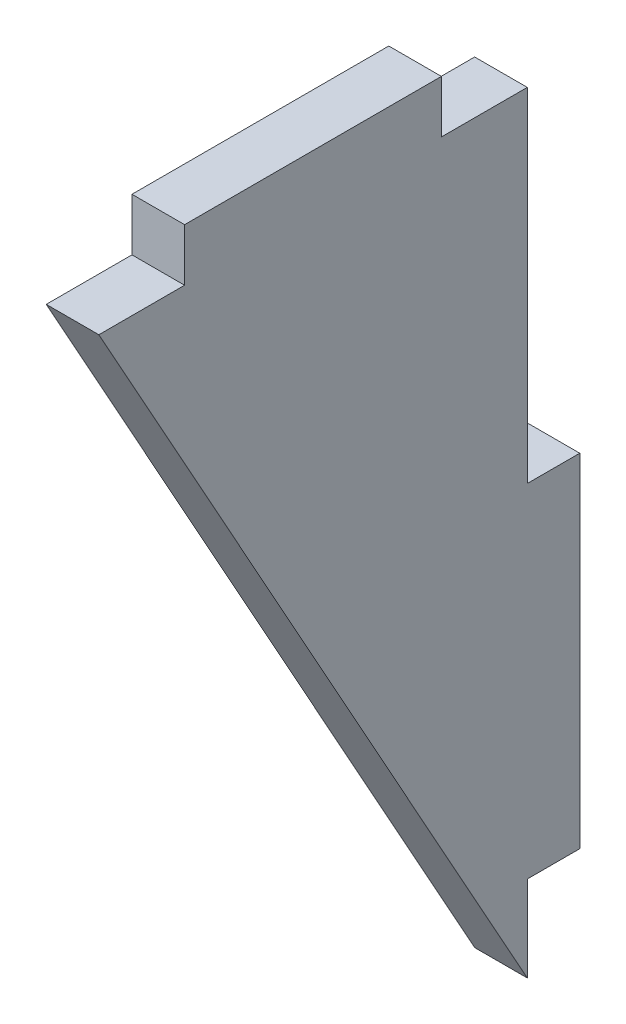
ISO-10303-21;
HEADER;
FILE_DESCRIPTION(('STEP AP214'),'2;1');
FILE_NAME('part.step','',(''),(''),'','','');
FILE_SCHEMA(('AUTOMOTIVE_DESIGN { 1 0 10303 214 1 1 1 1 }'));
ENDSEC;
DATA;
#1=APPLICATION_CONTEXT('core data for automotive mechanical design processes');
#2=APPLICATION_PROTOCOL_DEFINITION('international standard','automotive_design',2000,#1);
#3=PRODUCT_CONTEXT('',#1,'mechanical');
#4=PRODUCT('Part','Part','',(#3));
#5=PRODUCT_RELATED_PRODUCT_CATEGORY('part','',(#4));
#6=PRODUCT_DEFINITION_FORMATION('','',#4);
#7=PRODUCT_DEFINITION_CONTEXT('part definition',#1,'design');
#8=PRODUCT_DEFINITION('design','',#6,#7);
#9=PRODUCT_DEFINITION_SHAPE('','',#8);
#10=(LENGTH_UNIT() NAMED_UNIT(*) SI_UNIT(.MILLI.,.METRE.));
#11=(NAMED_UNIT(*) PLANE_ANGLE_UNIT() SI_UNIT($,.RADIAN.));
#12=(NAMED_UNIT(*) SI_UNIT($,.STERADIAN.) SOLID_ANGLE_UNIT());
#13=UNCERTAINTY_MEASURE_WITH_UNIT(LENGTH_MEASURE(1.E-05),#10,'distance_accuracy_value','');
#14=(GEOMETRIC_REPRESENTATION_CONTEXT(3) GLOBAL_UNCERTAINTY_ASSIGNED_CONTEXT((#13)) GLOBAL_UNIT_ASSIGNED_CONTEXT((#10,
#11,#12)) REPRESENTATION_CONTEXT('',''));
#15=CARTESIAN_POINT('',(0.,0.,0.));
#16=DIRECTION('',(0.,0.,1.));
#17=DIRECTION('',(1.,0.,0.));
#18=AXIS2_PLACEMENT_3D('',#15,#16,#17);
#19=CARTESIAN_POINT('',(-43.08,-51.92,-24.06));
#20=DIRECTION('',(0.,-1.,0.));
#21=DIRECTION('',(0.,0.,-1.));
#22=AXIS2_PLACEMENT_3D('',#19,#20,#21);
#23=PLANE('',#22);
#24=DIRECTION('',(0.,0.,-1.));
#25=VECTOR('',#24,1.);
#26=CARTESIAN_POINT('',(-40.01,-51.92,-24.06));
#27=LINE('',#26,#25);
#28=CARTESIAN_POINT('',(-40.01,-51.92,-9.08));
#29=VERTEX_POINT('',#28);
#30=CARTESIAN_POINT('',(-40.01,-51.92,-24.06));
#31=VERTEX_POINT('',#30);
#32=EDGE_CURVE('E157',#29,#31,#27,.T.);
#33=ORIENTED_EDGE('',*,*,#32,.T.);
#34=DIRECTION('',(1.,0.,0.));
#35=VECTOR('',#34,1.);
#36=CARTESIAN_POINT('',(-43.08,-51.92,-24.06));
#37=LINE('',#36,#35);
#38=CARTESIAN_POINT('',(-43.08,-51.92,-24.06));
#39=VERTEX_POINT('',#38);
#40=EDGE_CURVE('E11',#39,#31,#37,.T.);
#41=ORIENTED_EDGE('',*,*,#40,.F.);
#42=DIRECTION('',(0.,0.,-1.));
#43=VECTOR('',#42,1.);
#44=CARTESIAN_POINT('',(-43.08,-51.92,-24.06));
#45=LINE('',#44,#43);
#46=CARTESIAN_POINT('',(-43.08,-51.92,-9.08));
#47=VERTEX_POINT('',#46);
#48=EDGE_CURVE('E177',#47,#39,#45,.T.);
#49=ORIENTED_EDGE('',*,*,#48,.F.);
#50=DIRECTION('',(1.,0.,0.));
#51=VECTOR('',#50,1.);
#52=CARTESIAN_POINT('',(-43.08,-51.92,-9.08));
#53=LINE('',#52,#51);
#54=EDGE_CURVE('E153',#47,#29,#53,.T.);
#55=ORIENTED_EDGE('',*,*,#54,.T.);
#56=EDGE_LOOP('',(#33,#41,#49,#55));
#57=FACE_BOUND('',#56,.T.);
#58=ADVANCED_FACE('F43',(#57),#23,.F.);
#59=CARTESIAN_POINT('',(-43.08,-54.98,-24.06));
#60=DIRECTION('',(0.,0.,1.));
#61=DIRECTION('',(1.,0.,0.));
#62=AXIS2_PLACEMENT_3D('',#59,#60,#61);
#63=PLANE('',#62);
#64=DIRECTION('',(0.,-1.,0.));
#65=VECTOR('',#64,1.);
#66=CARTESIAN_POINT('',(-40.01,-54.98,-24.06));
#67=LINE('',#66,#65);
#68=CARTESIAN_POINT('',(-40.01,-54.98,-24.06));
#69=VERTEX_POINT('',#68);
#70=EDGE_CURVE('E160',#31,#69,#67,.T.);
#71=ORIENTED_EDGE('',*,*,#70,.T.);
#72=DIRECTION('',(1.,0.,0.));
#73=VECTOR('',#72,1.);
#74=CARTESIAN_POINT('',(-43.08,-54.98,-24.06));
#75=LINE('',#74,#73);
#76=CARTESIAN_POINT('',(-43.08,-54.98,-24.06));
#77=VERTEX_POINT('',#76);
#78=EDGE_CURVE('E51',#77,#69,#75,.T.);
#79=ORIENTED_EDGE('',*,*,#78,.F.);
#80=DIRECTION('',(0.,-1.,0.));
#81=VECTOR('',#80,1.);
#82=CARTESIAN_POINT('',(-43.08,-54.98,-24.06));
#83=LINE('',#82,#81);
#84=EDGE_CURVE('E111',#39,#77,#83,.T.);
#85=ORIENTED_EDGE('',*,*,#84,.F.);
#86=ORIENTED_EDGE('',*,*,#40,.T.);
#87=EDGE_LOOP('',(#71,#79,#85,#86));
#88=FACE_BOUND('',#87,.T.);
#89=ADVANCED_FACE('F250',(#88),#63,.F.);
#90=CARTESIAN_POINT('',(-43.08,-54.98,-29.0699999999999));
#91=DIRECTION('',(0.,-1.,0.));
#92=DIRECTION('',(0.,0.,-1.));
#93=AXIS2_PLACEMENT_3D('',#90,#91,#92);
#94=PLANE('',#93);
#95=DIRECTION('',(0.,0.,-1.));
#96=VECTOR('',#95,1.);
#97=CARTESIAN_POINT('',(-40.01,-54.98,-29.0699999999999));
#98=LINE('',#97,#96);
#99=CARTESIAN_POINT('',(-40.01,-54.98,-29.0699999999999));
#100=VERTEX_POINT('',#99);
#101=EDGE_CURVE('E162',#69,#100,#98,.T.);
#102=ORIENTED_EDGE('',*,*,#101,.T.);
#103=DIRECTION('',(1.,0.,0.));
#104=VECTOR('',#103,1.);
#105=CARTESIAN_POINT('',(-43.08,-54.98,-29.0699999999999));
#106=LINE('',#105,#104);
#107=CARTESIAN_POINT('',(-43.08,-54.98,-29.0699999999999));
#108=VERTEX_POINT('',#107);
#109=EDGE_CURVE('E193',#108,#100,#106,.T.);
#110=ORIENTED_EDGE('',*,*,#109,.F.);
#111=DIRECTION('',(0.,0.,-1.));
#112=VECTOR('',#111,1.);
#113=CARTESIAN_POINT('',(-43.08,-54.98,-29.0699999999999));
#114=LINE('',#113,#112);
#115=EDGE_CURVE('E201',#77,#108,#114,.T.);
#116=ORIENTED_EDGE('',*,*,#115,.F.);
#117=ORIENTED_EDGE('',*,*,#78,.T.);
#118=EDGE_LOOP('',(#102,#110,#116,#117));
#119=FACE_BOUND('',#118,.T.);
#120=ADVANCED_FACE('F199',(#119),#94,.F.);
#121=CARTESIAN_POINT('',(-43.08,-74.99,-29.0699999999999));
#122=DIRECTION('',(0.,0.,1.));
#123=DIRECTION('',(1.,0.,0.));
#124=AXIS2_PLACEMENT_3D('',#121,#122,#123);
#125=PLANE('',#124);
#126=DIRECTION('',(0.,-1.,0.));
#127=VECTOR('',#126,1.);
#128=CARTESIAN_POINT('',(-40.01,-74.99,-29.0699999999999));
#129=LINE('',#128,#127);
#130=CARTESIAN_POINT('',(-40.01,-74.99,-29.0699999999999));
#131=VERTEX_POINT('',#130);
#132=EDGE_CURVE('E164',#100,#131,#129,.T.);
#133=ORIENTED_EDGE('',*,*,#132,.T.);
#134=DIRECTION('',(1.,0.,0.));
#135=VECTOR('',#134,1.);
#136=CARTESIAN_POINT('',(-43.08,-74.99,-29.0699999999999));
#137=LINE('',#136,#135);
#138=CARTESIAN_POINT('',(-43.08,-74.99,-29.0699999999999));
#139=VERTEX_POINT('',#138);
#140=EDGE_CURVE('E190',#139,#131,#137,.T.);
#141=ORIENTED_EDGE('',*,*,#140,.F.);
#142=DIRECTION('',(0.,-1.,0.));
#143=VECTOR('',#142,1.);
#144=CARTESIAN_POINT('',(-43.08,-74.99,-29.0699999999999));
#145=LINE('',#144,#143);
#146=EDGE_CURVE('E219',#108,#139,#145,.T.);
#147=ORIENTED_EDGE('',*,*,#146,.F.);
#148=ORIENTED_EDGE('',*,*,#109,.T.);
#149=EDGE_LOOP('',(#133,#141,#147,#148));
#150=FACE_BOUND('',#149,.T.);
#151=ADVANCED_FACE('F210',(#150),#125,.F.);
#152=CARTESIAN_POINT('',(-43.08,-74.99,-32.1299999999999));
#153=DIRECTION('',(0.,-1.,0.));
#154=DIRECTION('',(0.,0.,-1.));
#155=AXIS2_PLACEMENT_3D('',#152,#153,#154);
#156=PLANE('',#155);
#157=DIRECTION('',(0.,0.,-1.));
#158=VECTOR('',#157,1.);
#159=CARTESIAN_POINT('',(-40.01,-74.99,-32.1299999999999));
#160=LINE('',#159,#158);
#161=CARTESIAN_POINT('',(-40.01,-74.99,-32.1299999999999));
#162=VERTEX_POINT('',#161);
#163=EDGE_CURVE('E166',#131,#162,#160,.T.);
#164=ORIENTED_EDGE('',*,*,#163,.T.);
#165=DIRECTION('',(1.,0.,0.));
#166=VECTOR('',#165,1.);
#167=CARTESIAN_POINT('',(-43.08,-74.99,-32.1299999999999));
#168=LINE('',#167,#166);
#169=CARTESIAN_POINT('',(-43.08,-74.99,-32.1299999999999));
#170=VERTEX_POINT('',#169);
#171=EDGE_CURVE('E187',#170,#162,#168,.T.);
#172=ORIENTED_EDGE('',*,*,#171,.F.);
#173=DIRECTION('',(0.,0.,-1.));
#174=VECTOR('',#173,1.);
#175=CARTESIAN_POINT('',(-43.08,-74.99,-32.1299999999999));
#176=LINE('',#175,#174);
#177=EDGE_CURVE('E216',#139,#170,#176,.T.);
#178=ORIENTED_EDGE('',*,*,#177,.F.);
#179=ORIENTED_EDGE('',*,*,#140,.T.);
#180=EDGE_LOOP('',(#164,#172,#178,#179));
#181=FACE_BOUND('',#180,.T.);
#182=ADVANCED_FACE('F214',(#181),#156,.F.);
#183=CARTESIAN_POINT('',(-43.08,-94.97,-32.1299999999999));
#184=DIRECTION('',(0.,0.,1.));
#185=DIRECTION('',(1.,0.,0.));
#186=AXIS2_PLACEMENT_3D('',#183,#184,#185);
#187=PLANE('',#186);
#188=DIRECTION('',(0.,-1.,0.));
#189=VECTOR('',#188,1.);
#190=CARTESIAN_POINT('',(-40.01,-94.97,-32.1299999999999));
#191=LINE('',#190,#189);
#192=CARTESIAN_POINT('',(-40.01,-94.97,-32.1299999999999));
#193=VERTEX_POINT('',#192);
#194=EDGE_CURVE('E168',#162,#193,#191,.T.);
#195=ORIENTED_EDGE('',*,*,#194,.T.);
#196=DIRECTION('',(1.,0.,0.));
#197=VECTOR('',#196,1.);
#198=CARTESIAN_POINT('',(-43.08,-94.97,-32.1299999999999));
#199=LINE('',#198,#197);
#200=CARTESIAN_POINT('',(-43.08,-94.97,-32.1299999999999));
#201=VERTEX_POINT('',#200);
#202=EDGE_CURVE('E184',#201,#193,#199,.T.);
#203=ORIENTED_EDGE('',*,*,#202,.F.);
#204=DIRECTION('',(0.,-1.,0.));
#205=VECTOR('',#204,1.);
#206=CARTESIAN_POINT('',(-43.08,-94.97,-32.1299999999999));
#207=LINE('',#206,#205);
#208=EDGE_CURVE('E218',#170,#201,#207,.T.);
#209=ORIENTED_EDGE('',*,*,#208,.F.);
#210=ORIENTED_EDGE('',*,*,#171,.T.);
#211=EDGE_LOOP('',(#195,#203,#209,#210));
#212=FACE_BOUND('',#211,.T.);
#213=ADVANCED_FACE('F265',(#212),#187,.F.);
#214=CARTESIAN_POINT('',(-43.08,-94.97,-29.0699999999999));
#215=DIRECTION('',(0.,1.,0.));
#216=DIRECTION('',(0.,0.,1.));
#217=AXIS2_PLACEMENT_3D('',#214,#215,#216);
#218=PLANE('',#217);
#219=DIRECTION('',(0.,0.,1.));
#220=VECTOR('',#219,1.);
#221=CARTESIAN_POINT('',(-40.01,-94.97,-29.0699999999999));
#222=LINE('',#221,#220);
#223=CARTESIAN_POINT('',(-40.01,-94.97,-29.0699999999999));
#224=VERTEX_POINT('',#223);
#225=EDGE_CURVE('E170',#193,#224,#222,.T.);
#226=ORIENTED_EDGE('',*,*,#225,.T.);
#227=DIRECTION('',(1.,0.,0.));
#228=VECTOR('',#227,1.);
#229=CARTESIAN_POINT('',(-43.08,-94.97,-29.0699999999999));
#230=LINE('',#229,#228);
#231=CARTESIAN_POINT('',(-43.08,-94.97,-29.0699999999999));
#232=VERTEX_POINT('',#231);
#233=EDGE_CURVE('E181',#232,#224,#230,.T.);
#234=ORIENTED_EDGE('',*,*,#233,.F.);
#235=DIRECTION('',(0.,0.,1.));
#236=VECTOR('',#235,1.);
#237=CARTESIAN_POINT('',(-43.08,-94.97,-29.0699999999999));
#238=LINE('',#237,#236);
#239=EDGE_CURVE('E221',#201,#232,#238,.T.);
#240=ORIENTED_EDGE('',*,*,#239,.F.);
#241=ORIENTED_EDGE('',*,*,#202,.T.);
#242=EDGE_LOOP('',(#226,#234,#240,#241));
#243=FACE_BOUND('',#242,.T.);
#244=ADVANCED_FACE('F230',(#243),#218,.F.);
#245=CARTESIAN_POINT('',(-43.08,-99.97,-29.0699999999999));
#246=DIRECTION('',(0.,0.,1.));
#247=DIRECTION('',(1.,0.,0.));
#248=AXIS2_PLACEMENT_3D('',#245,#246,#247);
#249=PLANE('',#248);
#250=DIRECTION('',(0.,-1.,0.));
#251=VECTOR('',#250,1.);
#252=CARTESIAN_POINT('',(-40.01,-99.97,-29.0699999999999));
#253=LINE('',#252,#251);
#254=CARTESIAN_POINT('',(-40.01,-99.97,-29.0699999999999));
#255=VERTEX_POINT('',#254);
#256=EDGE_CURVE('E172',#224,#255,#253,.T.);
#257=ORIENTED_EDGE('',*,*,#256,.T.);
#258=DIRECTION('',(1.,0.,0.));
#259=VECTOR('',#258,1.);
#260=CARTESIAN_POINT('',(-43.08,-99.97,-29.0699999999999));
#261=LINE('',#260,#259);
#262=CARTESIAN_POINT('',(-43.08,-99.97,-29.0699999999999));
#263=VERTEX_POINT('',#262);
#264=EDGE_CURVE('E148',#263,#255,#261,.T.);
#265=ORIENTED_EDGE('',*,*,#264,.F.);
#266=DIRECTION('',(0.,-1.,0.));
#267=VECTOR('',#266,1.);
#268=CARTESIAN_POINT('',(-43.08,-99.97,-29.0699999999999));
#269=LINE('',#268,#267);
#270=EDGE_CURVE('E139',#232,#263,#269,.T.);
#271=ORIENTED_EDGE('',*,*,#270,.F.);
#272=ORIENTED_EDGE('',*,*,#233,.T.);
#273=EDGE_LOOP('',(#257,#265,#271,#272));
#274=FACE_BOUND('',#273,.T.);
#275=ADVANCED_FACE('F234',(#274),#249,.F.);
#276=CARTESIAN_POINT('',(-43.08,-54.98,-4.08));
#277=DIRECTION('',(0.,0.4855769382292,-0.874193935611518));
#278=DIRECTION('',(0.,0.874193935611518,0.4855769382292));
#279=AXIS2_PLACEMENT_3D('',#276,#277,#278);
#280=PLANE('',#279);
#281=DIRECTION('',(0.,0.874193935611518,0.4855769382292));
#282=VECTOR('',#281,1.);
#283=CARTESIAN_POINT('',(-40.01,-54.98,-4.08));
#284=LINE('',#283,#282);
#285=CARTESIAN_POINT('',(-40.01,-54.98,-4.08));
#286=VERTEX_POINT('',#285);
#287=EDGE_CURVE('E147',#255,#286,#284,.T.);
#288=ORIENTED_EDGE('',*,*,#287,.T.);
#289=DIRECTION('',(1.,0.,0.));
#290=VECTOR('',#289,1.);
#291=CARTESIAN_POINT('',(-43.08,-54.98,-4.08));
#292=LINE('',#291,#290);
#293=CARTESIAN_POINT('',(-43.08,-54.98,-4.08));
#294=VERTEX_POINT('',#293);
#295=EDGE_CURVE('E144',#294,#286,#292,.T.);
#296=ORIENTED_EDGE('',*,*,#295,.F.);
#297=DIRECTION('',(0.,0.874193935611518,0.4855769382292));
#298=VECTOR('',#297,1.);
#299=CARTESIAN_POINT('',(-43.08,-54.98,-4.08));
#300=LINE('',#299,#298);
#301=EDGE_CURVE('E133',#263,#294,#300,.T.);
#302=ORIENTED_EDGE('',*,*,#301,.F.);
#303=ORIENTED_EDGE('',*,*,#264,.T.);
#304=EDGE_LOOP('',(#288,#296,#302,#303));
#305=FACE_BOUND('',#304,.T.);
#306=ADVANCED_FACE('F145',(#305),#280,.F.);
#307=CARTESIAN_POINT('',(-43.08,-54.98,-9.08));
#308=DIRECTION('',(0.,-1.,0.));
#309=DIRECTION('',(0.,0.,-1.));
#310=AXIS2_PLACEMENT_3D('',#307,#308,#309);
#311=PLANE('',#310);
#312=DIRECTION('',(0.,0.,-1.));
#313=VECTOR('',#312,1.);
#314=CARTESIAN_POINT('',(-40.01,-54.98,-9.08));
#315=LINE('',#314,#313);
#316=CARTESIAN_POINT('',(-40.01,-54.98,-9.08));
#317=VERTEX_POINT('',#316);
#318=EDGE_CURVE('E97',#286,#317,#315,.T.);
#319=ORIENTED_EDGE('',*,*,#318,.T.);
#320=DIRECTION('',(1.,0.,0.));
#321=VECTOR('',#320,1.);
#322=CARTESIAN_POINT('',(-43.08,-54.98,-9.08));
#323=LINE('',#322,#321);
#324=CARTESIAN_POINT('',(-43.08,-54.98,-9.08));
#325=VERTEX_POINT('',#324);
#326=EDGE_CURVE('E149',#325,#317,#323,.T.);
#327=ORIENTED_EDGE('',*,*,#326,.F.);
#328=DIRECTION('',(0.,0.,-1.));
#329=VECTOR('',#328,1.);
#330=CARTESIAN_POINT('',(-43.08,-54.98,-9.08));
#331=LINE('',#330,#329);
#332=EDGE_CURVE('E137',#294,#325,#331,.T.);
#333=ORIENTED_EDGE('',*,*,#332,.F.);
#334=ORIENTED_EDGE('',*,*,#295,.T.);
#335=EDGE_LOOP('',(#319,#327,#333,#334));
#336=FACE_BOUND('',#335,.T.);
#337=ADVANCED_FACE('F151',(#336),#311,.F.);
#338=CARTESIAN_POINT('',(-43.08,-51.92,-9.08));
#339=DIRECTION('',(0.,0.,-1.));
#340=DIRECTION('',(-1.,0.,0.));
#341=AXIS2_PLACEMENT_3D('',#338,#339,#340);
#342=PLANE('',#341);
#343=DIRECTION('',(0.,1.,0.));
#344=VECTOR('',#343,1.);
#345=CARTESIAN_POINT('',(-40.01,-51.92,-9.08));
#346=LINE('',#345,#344);
#347=EDGE_CURVE('E103',#317,#29,#346,.T.);
#348=ORIENTED_EDGE('',*,*,#347,.T.);
#349=ORIENTED_EDGE('',*,*,#54,.F.);
#350=DIRECTION('',(0.,1.,0.));
#351=VECTOR('',#350,1.);
#352=CARTESIAN_POINT('',(-43.08,-51.92,-9.08));
#353=LINE('',#352,#351);
#354=EDGE_CURVE('E59',#325,#47,#353,.T.);
#355=ORIENTED_EDGE('',*,*,#354,.F.);
#356=ORIENTED_EDGE('',*,*,#326,.T.);
#357=EDGE_LOOP('',(#348,#349,#355,#356));
#358=FACE_BOUND('',#357,.T.);
#359=ADVANCED_FACE('F238',(#358),#342,.F.);
#360=CARTESIAN_POINT('',(-43.08,0.,0.));
#361=DIRECTION('',(1.,0.,0.));
#362=DIRECTION('',(0.,0.,-1.));
#363=AXIS2_PLACEMENT_3D('',#360,#361,#362);
#364=PLANE('',#363);
#365=ORIENTED_EDGE('',*,*,#48,.T.);
#366=ORIENTED_EDGE('',*,*,#84,.T.);
#367=ORIENTED_EDGE('',*,*,#115,.T.);
#368=ORIENTED_EDGE('',*,*,#146,.T.);
#369=ORIENTED_EDGE('',*,*,#177,.T.);
#370=ORIENTED_EDGE('',*,*,#208,.T.);
#371=ORIENTED_EDGE('',*,*,#239,.T.);
#372=ORIENTED_EDGE('',*,*,#270,.T.);
#373=ORIENTED_EDGE('',*,*,#301,.T.);
#374=ORIENTED_EDGE('',*,*,#332,.T.);
#375=ORIENTED_EDGE('',*,*,#354,.T.);
#376=EDGE_LOOP('',(#365,#366,#367,#368,#369,#370,#371,#372,#373,#374,#375));
#377=FACE_BOUND('',#376,.T.);
#378=ADVANCED_FACE('F135',(#377),#364,.F.);
#379=CARTESIAN_POINT('',(-40.01,0.,0.));
#380=DIRECTION('',(1.,0.,0.));
#381=DIRECTION('',(0.,0.,-1.));
#382=AXIS2_PLACEMENT_3D('',#379,#380,#381);
#383=PLANE('',#382);
#384=ORIENTED_EDGE('',*,*,#32,.F.);
#385=ORIENTED_EDGE('',*,*,#347,.F.);
#386=ORIENTED_EDGE('',*,*,#318,.F.);
#387=ORIENTED_EDGE('',*,*,#287,.F.);
#388=ORIENTED_EDGE('',*,*,#256,.F.);
#389=ORIENTED_EDGE('',*,*,#225,.F.);
#390=ORIENTED_EDGE('',*,*,#194,.F.);
#391=ORIENTED_EDGE('',*,*,#163,.F.);
#392=ORIENTED_EDGE('',*,*,#132,.F.);
#393=ORIENTED_EDGE('',*,*,#101,.F.);
#394=ORIENTED_EDGE('',*,*,#70,.F.);
#395=EDGE_LOOP('',(#384,#385,#386,#387,#388,#389,#390,#391,#392,#393,#394));
#396=FACE_BOUND('',#395,.T.);
#397=ADVANCED_FACE('F205',(#396),#383,.T.);
#398=CLOSED_SHELL('',(#58,#89,#120,#151,#182,#213,#244,#275,#306,#337,#359,#378,#397));
#399=MANIFOLD_SOLID_BREP('B2',#398);
#400=ADVANCED_BREP_SHAPE_REPRESENTATION('',(#18,#399),#14);
#401=SHAPE_DEFINITION_REPRESENTATION(#9,#400);
ENDSEC;
END-ISO-10303-21;
